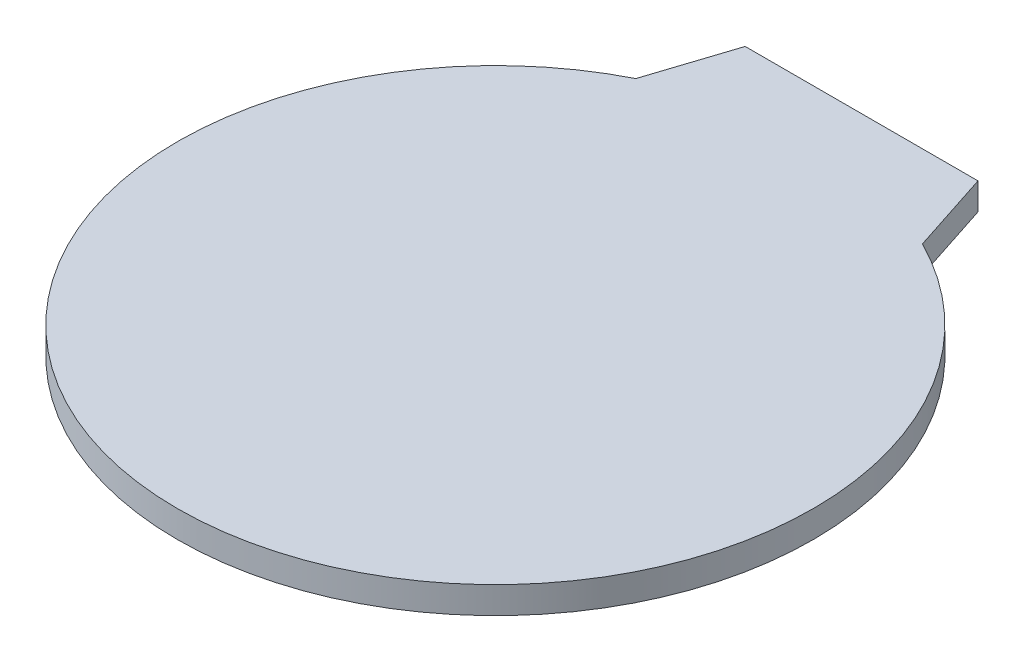
ISO-10303-21;
HEADER;
FILE_DESCRIPTION(('STEP AP214'),'2;1');
FILE_NAME('part.step','',(''),(''),'','','');
FILE_SCHEMA(('AUTOMOTIVE_DESIGN { 1 0 10303 214 1 1 1 1 }'));
ENDSEC;
DATA;
#1=APPLICATION_CONTEXT('core data for automotive mechanical design processes');
#2=APPLICATION_PROTOCOL_DEFINITION('international standard','automotive_design',2000,#1);
#3=PRODUCT_CONTEXT('',#1,'mechanical');
#4=PRODUCT('Part','Part','',(#3));
#5=PRODUCT_RELATED_PRODUCT_CATEGORY('part','',(#4));
#6=PRODUCT_DEFINITION_FORMATION('','',#4);
#7=PRODUCT_DEFINITION_CONTEXT('part definition',#1,'design');
#8=PRODUCT_DEFINITION('design','',#6,#7);
#9=PRODUCT_DEFINITION_SHAPE('','',#8);
#10=(LENGTH_UNIT() NAMED_UNIT(*) SI_UNIT(.MILLI.,.METRE.));
#11=(NAMED_UNIT(*) PLANE_ANGLE_UNIT() SI_UNIT($,.RADIAN.));
#12=(NAMED_UNIT(*) SI_UNIT($,.STERADIAN.) SOLID_ANGLE_UNIT());
#13=UNCERTAINTY_MEASURE_WITH_UNIT(LENGTH_MEASURE(1.E-05),#10,'distance_accuracy_value','');
#14=(GEOMETRIC_REPRESENTATION_CONTEXT(3) GLOBAL_UNCERTAINTY_ASSIGNED_CONTEXT((#13)) GLOBAL_UNIT_ASSIGNED_CONTEXT((#10,
#11,#12)) REPRESENTATION_CONTEXT('',''));
#15=CARTESIAN_POINT('',(0.,0.,0.));
#16=DIRECTION('',(0.,0.,1.));
#17=DIRECTION('',(1.,0.,0.));
#18=AXIS2_PLACEMENT_3D('',#15,#16,#17);
#19=CARTESIAN_POINT('',(-11.8987177447543,1.5,-3.87576332370801));
#20=DIRECTION('',(0.950829969533555,0.,0.309713365931821));
#21=DIRECTION('',(0.309713365931821,0.,-0.950829969533555));
#22=AXIS2_PLACEMENT_3D('',#19,#20,#21);
#23=PLANE('',#22);
#24=DIRECTION('',(-0.309713365931821,0.,0.950829969533555));
#25=VECTOR('',#24,1.);
#26=CARTESIAN_POINT('',(-11.8987177447543,0.,-3.87576332370801));
#27=LINE('',#26,#25);
#28=CARTESIAN_POINT('',(-6.5,0.,-20.45));
#29=VERTEX_POINT('',#28);
#30=CARTESIAN_POINT('',(-8.,0.,-15.8449518774908));
#31=VERTEX_POINT('',#30);
#32=EDGE_CURVE('E98',#29,#31,#27,.T.);
#33=ORIENTED_EDGE('',*,*,#32,.T.);
#34=DIRECTION('',(0.,-1.,0.));
#35=VECTOR('',#34,1.);
#36=CARTESIAN_POINT('',(-8.,1.5,-15.8449518774908));
#37=LINE('',#36,#35);
#38=CARTESIAN_POINT('',(-8.,1.5,-15.8449518774908));
#39=VERTEX_POINT('',#38);
#40=EDGE_CURVE('E11',#39,#31,#37,.T.);
#41=ORIENTED_EDGE('',*,*,#40,.F.);
#42=DIRECTION('',(-0.309713365931821,0.,0.950829969533555));
#43=VECTOR('',#42,1.);
#44=CARTESIAN_POINT('',(-11.8987177447543,1.5,-3.87576332370801));
#45=LINE('',#44,#43);
#46=CARTESIAN_POINT('',(-6.5,1.5,-20.45));
#47=VERTEX_POINT('',#46);
#48=EDGE_CURVE('E84',#47,#39,#45,.T.);
#49=ORIENTED_EDGE('',*,*,#48,.F.);
#50=DIRECTION('',(0.,-1.,0.));
#51=VECTOR('',#50,1.);
#52=CARTESIAN_POINT('',(-6.5,1.5,-20.45));
#53=LINE('',#52,#51);
#54=EDGE_CURVE('E51',#47,#29,#53,.T.);
#55=ORIENTED_EDGE('',*,*,#54,.T.);
#56=EDGE_LOOP('',(#33,#41,#49,#55));
#57=FACE_BOUND('',#56,.T.);
#58=ADVANCED_FACE('F35',(#57),#23,.F.);
#59=CARTESIAN_POINT('',(0.,1.5,0.));
#60=DIRECTION('',(0.,-1.,0.));
#61=DIRECTION('',(0.,0.,-1.));
#62=AXIS2_PLACEMENT_3D('',#59,#60,#61);
#63=CYLINDRICAL_SURFACE('',#62,17.75);
#64=CARTESIAN_POINT('',(0.,0.,0.));
#65=DIRECTION('',(0.,1.,0.));
#66=DIRECTION('',(0.,0.,1.));
#67=AXIS2_PLACEMENT_3D('',#64,#65,#66);
#68=CIRCLE('',#67,17.75);
#69=CARTESIAN_POINT('',(8.,0.,-15.8449518774908));
#70=VERTEX_POINT('',#69);
#71=EDGE_CURVE('E89',#31,#70,#68,.T.);
#72=ORIENTED_EDGE('',*,*,#71,.T.);
#73=DIRECTION('',(0.,-1.,0.));
#74=VECTOR('',#73,1.);
#75=CARTESIAN_POINT('',(8.,1.5,-15.8449518774908));
#76=LINE('',#75,#74);
#77=CARTESIAN_POINT('',(8.,1.5,-15.8449518774908));
#78=VERTEX_POINT('',#77);
#79=EDGE_CURVE('E43',#78,#70,#76,.T.);
#80=ORIENTED_EDGE('',*,*,#79,.F.);
#81=CARTESIAN_POINT('',(0.,1.5,0.));
#82=DIRECTION('',(0.,1.,0.));
#83=DIRECTION('',(0.,0.,1.));
#84=AXIS2_PLACEMENT_3D('',#81,#82,#83);
#85=CIRCLE('',#84,17.75);
#86=EDGE_CURVE('E76',#39,#78,#85,.T.);
#87=ORIENTED_EDGE('',*,*,#86,.F.);
#88=ORIENTED_EDGE('',*,*,#40,.T.);
#89=EDGE_LOOP('',(#72,#80,#87,#88));
#90=FACE_BOUND('',#89,.T.);
#91=ADVANCED_FACE('F88',(#90),#63,.T.);
#92=CARTESIAN_POINT('',(11.8987177447543,1.5,-3.87576332370801));
#93=DIRECTION('',(0.950829969533555,0.,-0.309713365931821));
#94=DIRECTION('',(-0.309713365931821,0.,-0.950829969533555));
#95=AXIS2_PLACEMENT_3D('',#92,#93,#94);
#96=PLANE('',#95);
#97=DIRECTION('',(0.309713365931821,0.,0.950829969533555));
#98=VECTOR('',#97,1.);
#99=CARTESIAN_POINT('',(11.8987177447543,0.,-3.87576332370801));
#100=LINE('',#99,#98);
#101=CARTESIAN_POINT('',(6.5,0.,-20.45));
#102=VERTEX_POINT('',#101);
#103=EDGE_CURVE('E101',#102,#70,#100,.T.);
#104=ORIENTED_EDGE('',*,*,#103,.F.);
#105=DIRECTION('',(0.,-1.,0.));
#106=VECTOR('',#105,1.);
#107=CARTESIAN_POINT('',(6.5,1.5,-20.45));
#108=LINE('',#107,#106);
#109=CARTESIAN_POINT('',(6.5,1.5,-20.45));
#110=VERTEX_POINT('',#109);
#111=EDGE_CURVE('E65',#110,#102,#108,.T.);
#112=ORIENTED_EDGE('',*,*,#111,.F.);
#113=DIRECTION('',(0.309713365931821,0.,0.950829969533555));
#114=VECTOR('',#113,1.);
#115=CARTESIAN_POINT('',(11.8987177447543,1.5,-3.87576332370801));
#116=LINE('',#115,#114);
#117=EDGE_CURVE('E83',#110,#78,#116,.T.);
#118=ORIENTED_EDGE('',*,*,#117,.T.);
#119=ORIENTED_EDGE('',*,*,#79,.T.);
#120=EDGE_LOOP('',(#104,#112,#118,#119));
#121=FACE_BOUND('',#120,.T.);
#122=ADVANCED_FACE('F92',(#121),#96,.T.);
#123=CARTESIAN_POINT('',(0.,1.5,-20.45));
#124=DIRECTION('',(0.,0.,-1.));
#125=DIRECTION('',(-1.,0.,0.));
#126=AXIS2_PLACEMENT_3D('',#123,#124,#125);
#127=PLANE('',#126);
#128=DIRECTION('',(1.,0.,0.));
#129=VECTOR('',#128,1.);
#130=CARTESIAN_POINT('',(0.,0.,-20.45));
#131=LINE('',#130,#129);
#132=EDGE_CURVE('E103',#29,#102,#131,.T.);
#133=ORIENTED_EDGE('',*,*,#132,.F.);
#134=ORIENTED_EDGE('',*,*,#54,.F.);
#135=DIRECTION('',(1.,0.,0.));
#136=VECTOR('',#135,1.);
#137=CARTESIAN_POINT('',(0.,1.5,-20.45));
#138=LINE('',#137,#136);
#139=EDGE_CURVE('E93',#47,#110,#138,.T.);
#140=ORIENTED_EDGE('',*,*,#139,.T.);
#141=ORIENTED_EDGE('',*,*,#111,.T.);
#142=EDGE_LOOP('',(#133,#134,#140,#141));
#143=FACE_BOUND('',#142,.T.);
#144=ADVANCED_FACE('F109',(#143),#127,.T.);
#145=CARTESIAN_POINT('',(0.,1.5,0.));
#146=DIRECTION('',(0.,1.,0.));
#147=DIRECTION('',(0.,0.,1.));
#148=AXIS2_PLACEMENT_3D('',#145,#146,#147);
#149=PLANE('',#148);
#150=ORIENTED_EDGE('',*,*,#48,.T.);
#151=ORIENTED_EDGE('',*,*,#86,.T.);
#152=ORIENTED_EDGE('',*,*,#117,.F.);
#153=ORIENTED_EDGE('',*,*,#139,.F.);
#154=EDGE_LOOP('',(#150,#151,#152,#153));
#155=FACE_BOUND('',#154,.T.);
#156=ADVANCED_FACE('F80',(#155),#149,.T.);
#157=CARTESIAN_POINT('',(0.,0.,0.));
#158=DIRECTION('',(0.,1.,0.));
#159=DIRECTION('',(0.,0.,1.));
#160=AXIS2_PLACEMENT_3D('',#157,#158,#159);
#161=PLANE('',#160);
#162=ORIENTED_EDGE('',*,*,#32,.F.);
#163=ORIENTED_EDGE('',*,*,#132,.T.);
#164=ORIENTED_EDGE('',*,*,#103,.T.);
#165=ORIENTED_EDGE('',*,*,#71,.F.);
#166=EDGE_LOOP('',(#162,#163,#164,#165));
#167=FACE_BOUND('',#166,.T.);
#168=ADVANCED_FACE('F108',(#167),#161,.F.);
#169=CLOSED_SHELL('',(#58,#91,#122,#144,#156,#168));
#170=MANIFOLD_SOLID_BREP('B2',#169);
#171=ADVANCED_BREP_SHAPE_REPRESENTATION('',(#18,#170),#14);
#172=SHAPE_DEFINITION_REPRESENTATION(#9,#171);
ENDSEC;
END-ISO-10303-21;
